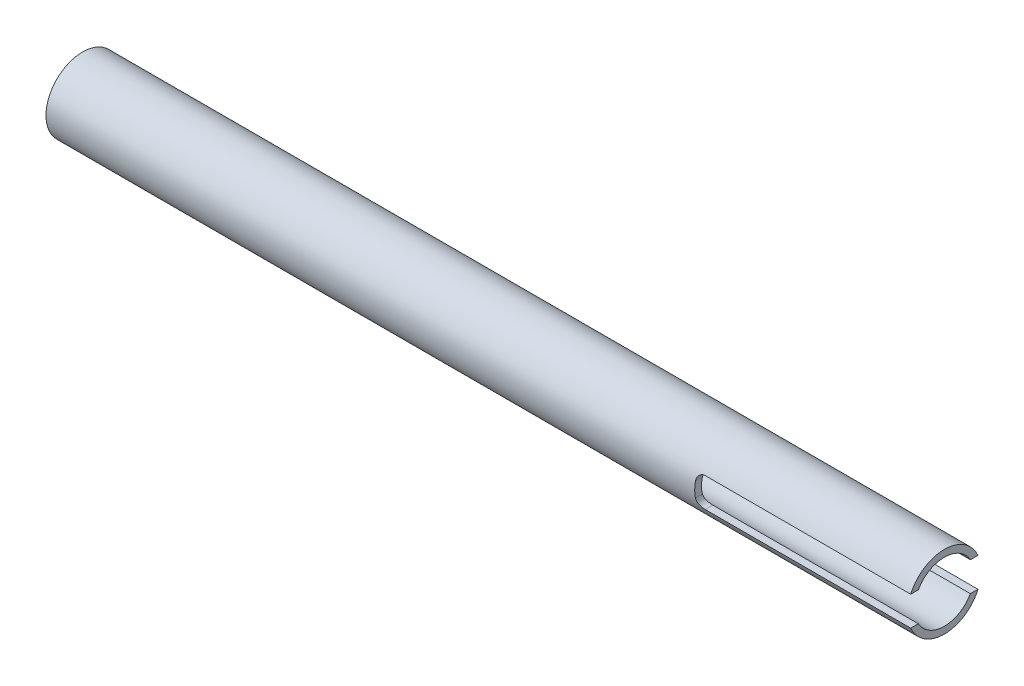
ISO-10303-21;
HEADER;
FILE_DESCRIPTION(('STEP AP214'),'2;1');
FILE_NAME('part.step','',(''),(''),'','','');
FILE_SCHEMA(('AUTOMOTIVE_DESIGN { 1 0 10303 214 1 1 1 1 }'));
ENDSEC;
DATA;
#1=APPLICATION_CONTEXT('core data for automotive mechanical design processes');
#2=APPLICATION_PROTOCOL_DEFINITION('international standard','automotive_design',2000,#1);
#3=PRODUCT_CONTEXT('',#1,'mechanical');
#4=PRODUCT('Part','Part','',(#3));
#5=PRODUCT_RELATED_PRODUCT_CATEGORY('part','',(#4));
#6=PRODUCT_DEFINITION_FORMATION('','',#4);
#7=PRODUCT_DEFINITION_CONTEXT('part definition',#1,'design');
#8=PRODUCT_DEFINITION('design','',#6,#7);
#9=PRODUCT_DEFINITION_SHAPE('','',#8);
#10=(LENGTH_UNIT() NAMED_UNIT(*) SI_UNIT(.MILLI.,.METRE.));
#11=(NAMED_UNIT(*) PLANE_ANGLE_UNIT() SI_UNIT($,.RADIAN.));
#12=(NAMED_UNIT(*) SI_UNIT($,.STERADIAN.) SOLID_ANGLE_UNIT());
#13=UNCERTAINTY_MEASURE_WITH_UNIT(LENGTH_MEASURE(1.E-05),#10,'distance_accuracy_value','');
#14=(GEOMETRIC_REPRESENTATION_CONTEXT(3) GLOBAL_UNCERTAINTY_ASSIGNED_CONTEXT((#13)) GLOBAL_UNIT_ASSIGNED_CONTEXT((#10,
#11,#12)) REPRESENTATION_CONTEXT('',''));
#15=CARTESIAN_POINT('',(0.,0.,0.));
#16=DIRECTION('',(0.,0.,1.));
#17=DIRECTION('',(1.,0.,0.));
#18=AXIS2_PLACEMENT_3D('',#15,#16,#17);
#19=CARTESIAN_POINT('',(98.6103231601427,-4.7625,2.1524775964989E-13));
#20=DIRECTION('',(-1.,0.,0.));
#21=DIRECTION('',(0.,0.,1.));
#22=AXIS2_PLACEMENT_3D('',#19,#20,#21);
#23=PLANE('',#22);
#24=CARTESIAN_POINT('',(98.6103231601427,0.,0.));
#25=DIRECTION('',(-1.,0.,0.));
#26=DIRECTION('',(0.,0.,1.));
#27=AXIS2_PLACEMENT_3D('',#24,#25,#26);
#28=CIRCLE('',#27,7.9375);
#29=CARTESIAN_POINT('',(98.6103231601427,3.175,7.27483891574239));
#30=VERTEX_POINT('',#29);
#31=CARTESIAN_POINT('',(98.6103231601427,3.175,-7.27483891574239));
#32=VERTEX_POINT('',#31);
#33=EDGE_CURVE('E154',#30,#32,#28,.T.);
#34=ORIENTED_EDGE('',*,*,#33,.F.);
#35=DIRECTION('',(0.,0.,-1.));
#36=VECTOR('',#35,1.);
#37=CARTESIAN_POINT('',(98.6103231601427,3.175,2.1524775964989E-13));
#38=LINE('',#37,#36);
#39=CARTESIAN_POINT('',(98.6103231601427,3.175,5.63085690548073));
#40=VERTEX_POINT('',#39);
#41=EDGE_CURVE('E165',#30,#40,#38,.T.);
#42=ORIENTED_EDGE('',*,*,#41,.T.);
#43=CARTESIAN_POINT('',(98.6103231601427,0.,0.));
#44=DIRECTION('',(-1.,0.,0.));
#45=DIRECTION('',(0.,0.,1.));
#46=AXIS2_PLACEMENT_3D('',#43,#44,#45);
#47=CIRCLE('',#46,6.4643);
#48=CARTESIAN_POINT('',(98.6103231601427,3.175,-5.63085690548073));
#49=VERTEX_POINT('',#48);
#50=EDGE_CURVE('E140',#40,#49,#47,.T.);
#51=ORIENTED_EDGE('',*,*,#50,.T.);
#52=EDGE_CURVE('E162',#49,#32,#38,.T.);
#53=ORIENTED_EDGE('',*,*,#52,.T.);
#54=EDGE_LOOP('',(#34,#42,#51,#53));
#55=FACE_BOUND('',#54,.T.);
#56=ADVANCED_FACE('F33',(#55),#23,.F.);
#57=CARTESIAN_POINT('',(165.510963462816,0.,0.));
#58=DIRECTION('',(-1.,0.,0.));
#59=DIRECTION('',(0.,0.,1.));
#60=AXIS2_PLACEMENT_3D('',#57,#58,#59);
#61=CYLINDRICAL_SURFACE('',#60,7.9375);
#62=DIRECTION('',(-1.,0.,0.));
#63=VECTOR('',#62,1.);
#64=CARTESIAN_POINT('',(165.510963462816,-3.17500000000006,7.27483891574237));
#65=LINE('',#64,#63);
#66=CARTESIAN_POINT('',(98.6103231601427,-3.17500000000002,7.27483891574238));
#67=VERTEX_POINT('',#66);
#68=CARTESIAN_POINT('',(54.1603231601427,-3.17500000000006,7.27483891574237));
#69=VERTEX_POINT('',#68);
#70=EDGE_CURVE('E134',#67,#69,#65,.T.);
#71=ORIENTED_EDGE('',*,*,#70,.T.);
#72=CARTESIAN_POINT('',(54.1603231601427,-3.175,7.27483891574237));
#73=CARTESIAN_POINT('',(54.1179516081605,-3.17500168113659,7.27483586366097));
#74=CARTESIAN_POINT('',(54.0756019124971,-3.17330245165568,7.27558001702575));
#75=CARTESIAN_POINT('',(53.9912360980274,-3.16653661877879,7.278528185394));
#76=CARTESIAN_POINT('',(53.9492198826457,-3.16147102917759,7.28073176088511));
#77=CARTESIAN_POINT('',(53.8244375246308,-3.14133450163409,7.28945465778901));
#78=CARTESIAN_POINT('',(53.742557205541,-3.12132308750015,7.29808678684576));
#79=CARTESIAN_POINT('',(53.5836993175407,-3.06894040253672,7.32026684625098));
#80=CARTESIAN_POINT('',(53.5067183423535,-3.03657783085928,7.3338113164125));
#81=CARTESIAN_POINT('',(53.3593257619782,-2.96061234627716,7.36480545430105));
#82=CARTESIAN_POINT('',(53.288918905137,-2.91700139314279,7.38225791423852));
#83=CARTESIAN_POINT('',(53.1532446162687,-2.81767453343915,7.42075264717216));
#84=CARTESIAN_POINT('',(53.0883436065064,-2.761507548697,7.44191980144858));
#85=CARTESIAN_POINT('',(52.9686580828009,-2.63982081610504,7.48594933347426));
#86=CARTESIAN_POINT('',(52.9138775707845,-2.57429738653621,7.50881237683834));
#87=CARTESIAN_POINT('',(52.8122001837123,-2.43069507728353,7.55656843444929));
#88=CARTESIAN_POINT('',(52.7660956547369,-2.35206470826204,7.58149355937878));
#89=CARTESIAN_POINT('',(52.6879300505377,-2.18789362747879,7.63048866953836));
#90=CARTESIAN_POINT('',(52.6558615639308,-2.10235659094262,7.65455909988382));
#91=CARTESIAN_POINT('',(52.612036569158,-1.94541809174971,7.69573507431979));
#92=CARTESIAN_POINT('',(52.5974014643123,-1.87491037842448,7.71322855066071));
#93=CARTESIAN_POINT('',(52.5777857024585,-1.73219113401289,7.74654000063456));
#94=CARTESIAN_POINT('',(52.5728038714948,-1.65997981118744,7.76235817778308));
#95=CARTESIAN_POINT('',(52.5728231601427,-1.5875,7.77712993333659));
#96=B_SPLINE_CURVE_WITH_KNOTS('',3,(#72,#73,#74,#75,#76,#77,#78,#79,#80,#81,#82,#83,#84,#85,#86,
#87,#88,#89,#90,#91,#92,#93,#94,#95),.UNSPECIFIED.,.F.,.F.,(4,2,2,2,2,2,2,2,2,2,2,4),(0.,
0.127031494291908,0.254024749792386,0.506885265042627,0.759568013575092,1.01243188015945,
1.27651034681327,1.54069301498295,1.822890957958,2.10493971303589,2.32661111398098,
2.54825555529032),.UNSPECIFIED.);
#97=CARTESIAN_POINT('',(52.5728231601427,-1.5875,7.77712993333659));
#98=VERTEX_POINT('',#97);
#99=EDGE_CURVE('E246',#69,#98,#96,.T.);
#100=ORIENTED_EDGE('',*,*,#99,.T.);
#101=CARTESIAN_POINT('',(52.5728231601427,0.,0.));
#102=DIRECTION('',(-1.,0.,0.));
#103=DIRECTION('',(0.,0.,1.));
#104=AXIS2_PLACEMENT_3D('',#101,#102,#103);
#105=CIRCLE('',#104,7.9375);
#106=CARTESIAN_POINT('',(52.5728231601427,1.5875,7.77712993333659));
#107=VERTEX_POINT('',#106);
#108=EDGE_CURVE('E260',#98,#107,#105,.T.);
#109=ORIENTED_EDGE('',*,*,#108,.T.);
#110=CARTESIAN_POINT('',(52.5728231601427,1.5875,7.77712993333659));
#111=CARTESIAN_POINT('',(52.572823403733,1.63350676862773,7.76774126330065));
#112=CARTESIAN_POINT('',(52.57482406485,1.67940359564177,7.75794444810861));
#113=CARTESIAN_POINT('',(52.5827614281683,1.77068039580911,7.73762089991974));
#114=CARTESIAN_POINT('',(52.5886970969167,1.81606050148705,7.72709435922087));
#115=CARTESIAN_POINT('',(52.6122700461677,1.95078228156833,7.6945984520111));
#116=CARTESIAN_POINT('',(52.63567399309,2.03894812030823,7.67166299368629));
#117=CARTESIAN_POINT('',(52.6969541902617,2.20953807004376,7.62428385726793));
#118=CARTESIAN_POINT('',(52.7348228805214,2.29196515383515,7.59984097261638));
#119=CARTESIAN_POINT('',(52.8239701505632,2.44917385980105,7.55064502184106));
#120=CARTESIAN_POINT('',(52.875254318008,2.52395227814499,7.52589183057164));
#121=CARTESIAN_POINT('',(52.9912413659634,2.66543932718694,7.47696931777062));
#122=CARTESIAN_POINT('',(53.0562100910787,2.73193883493113,7.45282414598359));
#123=CARTESIAN_POINT('',(53.1973483049117,2.85299322074861,7.40732925012121));
#124=CARTESIAN_POINT('',(53.2735181882435,2.90754767783193,7.38597962458242));
#125=CARTESIAN_POINT('',(53.4330918887273,3.00159155783955,7.34825600672414));
#126=CARTESIAN_POINT('',(53.5162663439875,3.04142452291152,7.33177064627855));
#127=CARTESIAN_POINT('',(53.6890369760882,3.10622330269326,7.30455577634143));
#128=CARTESIAN_POINT('',(53.7786218532568,3.13121458917045,7.29381640854949));
#129=CARTESIAN_POINT('',(53.9176696730244,3.157101940763,7.28263004031741));
#130=CARTESIAN_POINT('',(53.9659248998652,3.16380495831029,7.27971714426164));
#131=CARTESIAN_POINT('',(54.0628843182944,3.17275416759985,7.2758193784974));
#132=CARTESIAN_POINT('',(54.1115881192123,3.17500392571316,7.27483296598247));
#133=CARTESIAN_POINT('',(54.1603231601427,3.175,7.27483891574239));
#134=B_SPLINE_CURVE_WITH_KNOTS('',3,(#110,#111,#112,#113,#114,#115,#116,#117,#118,#119,#120,
#121,#122,#123,#124,#125,#126,#127,#128,#129,#130,#131,#132,#133),.UNSPECIFIED.,.F.,.F.,(4,2,2,
2,2,2,2,2,2,2,2,4),(0.,0.140770845296605,0.281504734514007,0.562238948643031,0.842826637517772,
1.12353138019525,1.41029752992662,1.69707378478449,1.97665708187304,2.255759151943,
2.40195937855942,2.54804247399296),.UNSPECIFIED.);
#135=CARTESIAN_POINT('',(54.1603231601427,3.175,7.27483891574239));
#136=VERTEX_POINT('',#135);
#137=EDGE_CURVE('E196',#107,#136,#134,.T.);
#138=ORIENTED_EDGE('',*,*,#137,.T.);
#139=DIRECTION('',(-1.,0.,0.));
#140=VECTOR('',#139,1.);
#141=CARTESIAN_POINT('',(165.510963462816,3.175,7.27483891574239));
#142=LINE('',#141,#140);
#143=EDGE_CURVE('E258',#136,#30,#142,.F.);
#144=ORIENTED_EDGE('',*,*,#143,.T.);
#145=ORIENTED_EDGE('',*,*,#33,.T.);
#146=DIRECTION('',(-1.,0.,0.));
#147=VECTOR('',#146,1.);
#148=CARTESIAN_POINT('',(165.510963462816,3.175,-7.27483891574239));
#149=LINE('',#148,#147);
#150=CARTESIAN_POINT('',(54.1603231601427,3.175,-7.27483891574239));
#151=VERTEX_POINT('',#150);
#152=EDGE_CURVE('E283',#32,#151,#149,.T.);
#153=ORIENTED_EDGE('',*,*,#152,.T.);
#154=CARTESIAN_POINT('',(54.1603231601427,3.175,-7.27483891574239));
#155=CARTESIAN_POINT('',(54.1179516081605,3.17500168113659,-7.27483586366097));
#156=CARTESIAN_POINT('',(54.0756019124971,3.17330245165569,-7.27558001702575));
#157=CARTESIAN_POINT('',(53.9912360980274,3.16653661877879,-7.27852818539399));
#158=CARTESIAN_POINT('',(53.9492198826457,3.16147102917759,-7.28073176088511));
#159=CARTESIAN_POINT('',(53.8244375246308,3.1413345016341,-7.28945465778901));
#160=CARTESIAN_POINT('',(53.742557205541,3.12132308750015,-7.29808678684576));
#161=CARTESIAN_POINT('',(53.5836993175407,3.06894040253673,-7.32026684625098));
#162=CARTESIAN_POINT('',(53.5067183423535,3.03657783085928,-7.3338113164125));
#163=CARTESIAN_POINT('',(53.3593257619782,2.96061234627716,-7.36480545430105));
#164=CARTESIAN_POINT('',(53.288918905137,2.9170013931428,-7.38225791423852));
#165=CARTESIAN_POINT('',(53.1532446162687,2.81767453343915,-7.42075264717216));
#166=CARTESIAN_POINT('',(53.0883436065064,2.76150754869701,-7.44191980144858));
#167=CARTESIAN_POINT('',(52.9686580828009,2.63982081610504,-7.48594933347426));
#168=CARTESIAN_POINT('',(52.9138775707845,2.57429738653622,-7.50881237683833));
#169=CARTESIAN_POINT('',(52.8122001837123,2.43069507728354,-7.55656843444929));
#170=CARTESIAN_POINT('',(52.7660956547369,2.35206470826205,-7.58149355937878));
#171=CARTESIAN_POINT('',(52.6879300505377,2.1878936274788,-7.63048866953836));
#172=CARTESIAN_POINT('',(52.6558615639308,2.10235659094262,-7.65455909988382));
#173=CARTESIAN_POINT('',(52.612036569158,1.94541809174971,-7.69573507431979));
#174=CARTESIAN_POINT('',(52.5974014643123,1.87491037842449,-7.71322855066071));
#175=CARTESIAN_POINT('',(52.5777857024585,1.73219113401289,-7.74654000063456));
#176=CARTESIAN_POINT('',(52.5728038714948,1.65997981118744,-7.76235817778308));
#177=CARTESIAN_POINT('',(52.5728231601427,1.5875,-7.77712993333659));
#178=B_SPLINE_CURVE_WITH_KNOTS('',3,(#154,#155,#156,#157,#158,#159,#160,#161,#162,#163,#164,
#165,#166,#167,#168,#169,#170,#171,#172,#173,#174,#175,#176,#177),.UNSPECIFIED.,.F.,.F.,(4,2,2,
2,2,2,2,2,2,2,2,4),(0.,0.127031494291908,0.254024749792379,0.506885265042626,0.759568013575091,
1.01243188015945,1.27651034681327,1.54069301498295,1.822890957958,2.10493971303589,
2.32661111398098,2.54825555529032),.UNSPECIFIED.);
#179=CARTESIAN_POINT('',(52.5728231601427,1.5875,-7.77712993333659));
#180=VERTEX_POINT('',#179);
#181=EDGE_CURVE('E47',#151,#180,#178,.T.);
#182=ORIENTED_EDGE('',*,*,#181,.T.);
#183=CARTESIAN_POINT('',(52.5728231601427,-1.5875,-7.77712993333659));
#184=VERTEX_POINT('',#183);
#185=EDGE_CURVE('E287',#180,#184,#105,.T.);
#186=ORIENTED_EDGE('',*,*,#185,.T.);
#187=CARTESIAN_POINT('',(52.5728231601427,-1.5875,-7.77712993333659));
#188=CARTESIAN_POINT('',(52.572823403733,-1.63350676862772,-7.76774126330065));
#189=CARTESIAN_POINT('',(52.57482406485,-1.67940359564176,-7.75794444810861));
#190=CARTESIAN_POINT('',(52.5827614281683,-1.77068039580911,-7.73762089991974));
#191=CARTESIAN_POINT('',(52.5886970969167,-1.81606050148704,-7.72709435922087));
#192=CARTESIAN_POINT('',(52.6122700461677,-1.95078228156833,-7.6945984520111));
#193=CARTESIAN_POINT('',(52.63567399309,-2.03894812030822,-7.67166299368629));
#194=CARTESIAN_POINT('',(52.6969541902617,-2.20953807004376,-7.62428385726794));
#195=CARTESIAN_POINT('',(52.7348228805214,-2.29196515383515,-7.59984097261638));
#196=CARTESIAN_POINT('',(52.8239701505632,-2.44917385980105,-7.55064502184107));
#197=CARTESIAN_POINT('',(52.875254318008,-2.52395227814499,-7.52589183057165));
#198=CARTESIAN_POINT('',(52.9912413659634,-2.66543932718693,-7.47696931777062));
#199=CARTESIAN_POINT('',(53.0562100910787,-2.73193883493113,-7.4528241459836));
#200=CARTESIAN_POINT('',(53.1973483049117,-2.85299322074861,-7.40732925012122));
#201=CARTESIAN_POINT('',(53.2735181882435,-2.90754767783193,-7.38597962458242));
#202=CARTESIAN_POINT('',(53.4330918887273,-3.00159155783955,-7.34825600672415));
#203=CARTESIAN_POINT('',(53.5162663439875,-3.04142452291151,-7.33177064627855));
#204=CARTESIAN_POINT('',(53.6890369760882,-3.10622330269326,-7.30455577634143));
#205=CARTESIAN_POINT('',(53.7786218532568,-3.13121458917044,-7.2938164085495));
#206=CARTESIAN_POINT('',(53.9176696730244,-3.157101940763,-7.28263004031741));
#207=CARTESIAN_POINT('',(53.9659248998652,-3.16380495831028,-7.27971714426164));
#208=CARTESIAN_POINT('',(54.0628843182944,-3.17275416759984,-7.2758193784974));
#209=CARTESIAN_POINT('',(54.1115881192123,-3.17500392571316,-7.27483296598247));
#210=CARTESIAN_POINT('',(54.1603231601427,-3.175,-7.2748389157424));
#211=B_SPLINE_CURVE_WITH_KNOTS('',3,(#187,#188,#189,#190,#191,#192,#193,#194,#195,#196,#197,
#198,#199,#200,#201,#202,#203,#204,#205,#206,#207,#208,#209,#210),.UNSPECIFIED.,.F.,.F.,(4,2,2,
2,2,2,2,2,2,2,2,4),(0.,0.140770845296605,0.281504734514007,0.562238948643031,0.842826637517772,
1.12353138019525,1.41029752992662,1.69707378478449,1.97665708187304,2.255759151943,
2.40195937855943,2.54804247399297),.UNSPECIFIED.);
#212=CARTESIAN_POINT('',(54.1603231601427,-3.17500000000006,-7.27483891574237));
#213=VERTEX_POINT('',#212);
#214=EDGE_CURVE('E227',#184,#213,#211,.T.);
#215=ORIENTED_EDGE('',*,*,#214,.T.);
#216=DIRECTION('',(-1.,0.,0.));
#217=VECTOR('',#216,1.);
#218=CARTESIAN_POINT('',(165.510963462816,-3.17500000000006,-7.27483891574237));
#219=LINE('',#218,#217);
#220=CARTESIAN_POINT('',(98.6103231601427,-3.17500000000002,-7.27483891574238));
#221=VERTEX_POINT('',#220);
#222=EDGE_CURVE('E277',#213,#221,#219,.F.);
#223=ORIENTED_EDGE('',*,*,#222,.T.);
#224=EDGE_CURVE('E158',#221,#67,#28,.T.);
#225=ORIENTED_EDGE('',*,*,#224,.T.);
#226=EDGE_LOOP('',(#71,#100,#109,#138,#144,#145,#153,#182,#186,#215,#223,#225));
#227=FACE_BOUND('',#226,.T.);
#228=CARTESIAN_POINT('',(-87.67464295407,-1.66136895907165E-13,2.27596413937547E-13));
#229=DIRECTION('',(1.,0.,0.));
#230=DIRECTION('',(0.,0.,-1.));
#231=AXIS2_PLACEMENT_3D('',#228,#229,#230);
#232=CIRCLE('',#231,7.9375);
#233=CARTESIAN_POINT('',(-87.67464295407,-1.66412283258976E-13,-7.93749999999977));
#234=VERTEX_POINT('',#233);
#235=EDGE_CURVE('E292',#234,#234,#232,.T.);
#236=ORIENTED_EDGE('',*,*,#235,.T.);
#237=EDGE_LOOP('',(#236));
#238=FACE_BOUND('',#237,.T.);
#239=ADVANCED_FACE('F209',(#227,#238),#61,.T.);
#240=CARTESIAN_POINT('',(165.510963462816,0.,0.));
#241=DIRECTION('',(-1.,0.,0.));
#242=DIRECTION('',(0.,0.,1.));
#243=AXIS2_PLACEMENT_3D('',#240,#241,#242);
#244=CYLINDRICAL_SURFACE('',#243,6.4643);
#245=DIRECTION('',(-1.,0.,0.));
#246=VECTOR('',#245,1.);
#247=CARTESIAN_POINT('',(165.510963462816,3.175,5.63085690548073));
#248=LINE('',#247,#246);
#249=CARTESIAN_POINT('',(54.1603231601427,3.175,5.63085690548073));
#250=VERTEX_POINT('',#249);
#251=EDGE_CURVE('E268',#250,#40,#248,.F.);
#252=ORIENTED_EDGE('',*,*,#251,.F.);
#253=CARTESIAN_POINT('',(54.1603231601427,3.175,5.63085690548073));
#254=CARTESIAN_POINT('',(54.1191663294675,3.17500265942431,5.63085243150939));
#255=CARTESIAN_POINT('',(54.0780318072932,3.17339835018606,5.63176028239596));
#256=CARTESIAN_POINT('',(53.9961059919526,3.16701766507687,5.6353521570195));
#257=CARTESIAN_POINT('',(53.9553145511114,3.16224273305131,5.63803537228504));
#258=CARTESIAN_POINT('',(53.8343193243378,3.14329664507894,5.64863522411123));
#259=CARTESIAN_POINT('',(53.755007271897,3.12450305374455,5.65910325483872));
#260=CARTESIAN_POINT('',(53.6012573773987,3.0754916504055,5.68588522764517));
#261=CARTESIAN_POINT('',(53.5268129170788,3.0452897453746,5.7021910282914));
#262=CARTESIAN_POINT('',(53.3841452960827,2.97460119282056,5.73938277272117));
#263=CARTESIAN_POINT('',(53.3159294121919,2.93410271969421,5.76027397904373));
#264=CARTESIAN_POINT('',(53.1826514439318,2.84103773378421,5.80676804025646));
#265=CARTESIAN_POINT('',(53.1181052818695,2.78784532739572,5.83259254506422));
#266=CARTESIAN_POINT('',(52.9985385718316,2.67254263369961,5.88631786935968));
#267=CARTESIAN_POINT('',(52.9435224909978,2.61042818908352,5.91421965383983));
#268=CARTESIAN_POINT('',(52.8385056426909,2.47143371409535,5.97373371686979));
#269=CARTESIAN_POINT('',(52.7896952231351,2.39368295701582,6.00542032126396));
#270=CARTESIAN_POINT('',(52.7060678250846,2.2306822521568,6.0678536497522));
#271=CARTESIAN_POINT('',(52.6712438221118,2.14543609512391,6.09860083846706));
#272=CARTESIAN_POINT('',(52.6206465484794,1.98216120584023,6.15341243852268));
#273=CARTESIAN_POINT('',(52.6028496375441,1.90486553835026,6.17780100436403));
#274=CARTESIAN_POINT('',(52.5789204697349,1.74771289593288,6.22410888754503));
#275=CARTESIAN_POINT('',(52.5727973466511,1.66785396509172,6.24602625877211));
#276=CARTESIAN_POINT('',(52.5728231601427,1.5875,6.26634009929241));
#277=B_SPLINE_CURVE_WITH_KNOTS('',3,(#253,#254,#255,#256,#257,#258,#259,#260,#261,#262,#263,
#264,#265,#266,#267,#268,#269,#270,#271,#272,#273,#274,#275,#276),.UNSPECIFIED.,.F.,.F.,(4,2,2,
2,2,2,2,2,2,2,2,4),(0.,0.123386261727172,0.246716374037826,0.491934980105696,0.736812924701847,
0.981973392060158,1.24352761602777,1.50520411142378,1.7952497086635,2.08514945193374,
2.33322496948238,2.58149450643057),.UNSPECIFIED.);
#278=CARTESIAN_POINT('',(52.5728231601427,1.5875,6.26634009929241));
#279=VERTEX_POINT('',#278);
#280=EDGE_CURVE('E189',#250,#279,#277,.T.);
#281=ORIENTED_EDGE('',*,*,#280,.T.);
#282=CARTESIAN_POINT('',(52.5728231601427,0.,0.));
#283=DIRECTION('',(-1.,0.,0.));
#284=DIRECTION('',(0.,0.,1.));
#285=AXIS2_PLACEMENT_3D('',#282,#283,#284);
#286=CIRCLE('',#285,6.4643);
#287=CARTESIAN_POINT('',(52.5728231601427,-1.5875,6.26634009929241));
#288=VERTEX_POINT('',#287);
#289=EDGE_CURVE('E169',#288,#279,#286,.T.);
#290=ORIENTED_EDGE('',*,*,#289,.F.);
#291=CARTESIAN_POINT('',(52.5728231601427,-1.5875,6.26634009929241));
#292=CARTESIAN_POINT('',(52.572823381558,-1.63418900680278,6.25451519937794));
#293=CARTESIAN_POINT('',(52.5748836740983,-1.68071621150091,6.2421690242475));
#294=CARTESIAN_POINT('',(52.5830320857824,-1.77313930969813,6.21654599792507));
#295=CARTESIAN_POINT('',(52.589118660749,-1.81903543834437,6.20326950527711));
#296=CARTESIAN_POINT('',(52.6132295844974,-1.95507469082072,6.16228683989147));
#297=CARTESIAN_POINT('',(52.6371064034357,-2.04387534201677,6.13334935224698));
#298=CARTESIAN_POINT('',(52.6993911097832,-2.21532061503981,6.07353181019978));
#299=CARTESIAN_POINT('',(52.7377833915644,-2.29797173444354,6.04265387160463));
#300=CARTESIAN_POINT('',(52.8280183454589,-2.45546303738963,5.98038883139863));
#301=CARTESIAN_POINT('',(52.8798715772794,-2.53029702370295,5.94900134826912));
#302=CARTESIAN_POINT('',(52.9979952941519,-2.67287075398233,5.88635884745835));
#303=CARTESIAN_POINT('',(53.0647191797911,-2.74025626996522,5.85514963173659));
#304=CARTESIAN_POINT('',(53.2100564411628,-2.86271368076049,5.79626340236598));
#305=CARTESIAN_POINT('',(53.2886698104279,-2.91778558227084,5.76858638679577));
#306=CARTESIAN_POINT('',(53.4528917446734,-3.01168872656629,5.72010524984432));
#307=CARTESIAN_POINT('',(53.5381343480135,-3.05104502216775,5.6990849029132));
#308=CARTESIAN_POINT('',(53.7155351424931,-3.11430373465245,5.66476886814871));
#309=CARTESIAN_POINT('',(53.8076749418361,-3.13824572360375,5.6514534090763));
#310=CARTESIAN_POINT('',(53.9441679497105,-3.16081362599346,5.63883740321027));
#311=CARTESIAN_POINT('',(53.9871766967769,-3.16612512648615,5.63585394797714));
#312=CARTESIAN_POINT('',(54.0735547373811,-3.1732182894863,5.63186201493138));
#313=CARTESIAN_POINT('',(54.1169238561998,-3.17500157254309,5.63085263040865));
#314=CARTESIAN_POINT('',(54.1603231601427,-3.175,5.63085690548073));
#315=B_SPLINE_CURVE_WITH_KNOTS('',3,(#291,#292,#293,#294,#295,#296,#297,#298,#299,#300,#301,
#302,#303,#304,#305,#306,#307,#308,#309,#310,#311,#312,#313,#314),.UNSPECIFIED.,.F.,.F.,(4,2,2,
2,2,2,2,2,2,2,2,4),(0.,0.144388740940301,0.288722137366155,0.576452128922376,0.863873656489901,
1.15152134248761,1.44956694911564,1.74761239362143,2.03464137858756,2.32093052452345,
2.45108160789036,2.58117289753275),.UNSPECIFIED.);
#316=CARTESIAN_POINT('',(54.1603231601427,-3.17500000000006,5.63085690548069));
#317=VERTEX_POINT('',#316);
#318=EDGE_CURVE('E149',#288,#317,#315,.T.);
#319=ORIENTED_EDGE('',*,*,#318,.T.);
#320=DIRECTION('',(-1.,0.,0.));
#321=VECTOR('',#320,1.);
#322=CARTESIAN_POINT('',(165.510963462816,-3.17500000000006,5.63085690548069));
#323=LINE('',#322,#321);
#324=CARTESIAN_POINT('',(98.6103231601427,-3.17500000000002,5.63085690548072));
#325=VERTEX_POINT('',#324);
#326=EDGE_CURVE('E131',#325,#317,#323,.T.);
#327=ORIENTED_EDGE('',*,*,#326,.F.);
#328=CARTESIAN_POINT('',(98.6103231601427,-3.17500000000002,-5.63085690548072));
#329=VERTEX_POINT('',#328);
#330=EDGE_CURVE('E147',#329,#325,#47,.T.);
#331=ORIENTED_EDGE('',*,*,#330,.F.);
#332=DIRECTION('',(-1.,0.,0.));
#333=VECTOR('',#332,1.);
#334=CARTESIAN_POINT('',(165.510963462816,-3.17500000000006,-5.63085690548069));
#335=LINE('',#334,#333);
#336=CARTESIAN_POINT('',(54.1603231601427,-3.17500000000006,-5.63085690548069));
#337=VERTEX_POINT('',#336);
#338=EDGE_CURVE('E275',#337,#329,#335,.F.);
#339=ORIENTED_EDGE('',*,*,#338,.F.);
#340=CARTESIAN_POINT('',(54.1603231601427,-3.175,-5.63085690548069));
#341=CARTESIAN_POINT('',(54.1191663294675,-3.17500265942431,-5.63085243150938));
#342=CARTESIAN_POINT('',(54.0780318072932,-3.17339835018606,-5.63176028239596));
#343=CARTESIAN_POINT('',(53.9961059919526,-3.16701766507687,-5.63535215701951));
#344=CARTESIAN_POINT('',(53.9553145511114,-3.1622427330513,-5.63803537228504));
#345=CARTESIAN_POINT('',(53.8343193243378,-3.14329664507894,-5.64863522411123));
#346=CARTESIAN_POINT('',(53.755007271897,-3.12450305374455,-5.65910325483872));
#347=CARTESIAN_POINT('',(53.6012573773987,-3.0754916504055,-5.68588522764517));
#348=CARTESIAN_POINT('',(53.5268129170788,-3.0452897453746,-5.7021910282914));
#349=CARTESIAN_POINT('',(53.3841452960827,-2.97460119282056,-5.73938277272117));
#350=CARTESIAN_POINT('',(53.3159294121919,-2.93410271969421,-5.76027397904373));
#351=CARTESIAN_POINT('',(53.1826514439318,-2.84103773378421,-5.80676804025646));
#352=CARTESIAN_POINT('',(53.1181052818695,-2.78784532739572,-5.83259254506421));
#353=CARTESIAN_POINT('',(52.9985385718316,-2.67254263369961,-5.88631786935968));
#354=CARTESIAN_POINT('',(52.9435224909978,-2.61042818908352,-5.91421965383983));
#355=CARTESIAN_POINT('',(52.8385056426909,-2.47143371409535,-5.97373371686978));
#356=CARTESIAN_POINT('',(52.7896952231351,-2.39368295701582,-6.00542032126396));
#357=CARTESIAN_POINT('',(52.7060678250846,-2.23068225215681,-6.06785364975219));
#358=CARTESIAN_POINT('',(52.6712438221118,-2.14543609512391,-6.09860083846706));
#359=CARTESIAN_POINT('',(52.6206465484794,-1.98216120584023,-6.15341243852268));
#360=CARTESIAN_POINT('',(52.6028496375441,-1.90486553835026,-6.17780100436402));
#361=CARTESIAN_POINT('',(52.5789204697349,-1.74771289593288,-6.22410888754503));
#362=CARTESIAN_POINT('',(52.5727973466511,-1.66785396509172,-6.24602625877211));
#363=CARTESIAN_POINT('',(52.5728231601427,-1.5875,-6.26634009929241));
#364=B_SPLINE_CURVE_WITH_KNOTS('',3,(#340,#341,#342,#343,#344,#345,#346,#347,#348,#349,#350,
#351,#352,#353,#354,#355,#356,#357,#358,#359,#360,#361,#362,#363),.UNSPECIFIED.,.F.,.F.,(4,2,2,
2,2,2,2,2,2,2,2,4),(0.,0.123386261727166,0.246716374037827,0.49193498010569,0.73681292470184,
0.98197339206015,1.24352761602776,1.50520411142376,1.79524970866349,2.08514945193373,
2.33322496948237,2.58149450643057),.UNSPECIFIED.);
#365=CARTESIAN_POINT('',(52.5728231601427,-1.5875,-6.26634009929241));
#366=VERTEX_POINT('',#365);
#367=EDGE_CURVE('E221',#337,#366,#364,.T.);
#368=ORIENTED_EDGE('',*,*,#367,.T.);
#369=CARTESIAN_POINT('',(52.5728231601427,1.5875,-6.26634009929241));
#370=VERTEX_POINT('',#369);
#371=EDGE_CURVE('E166',#370,#366,#286,.T.);
#372=ORIENTED_EDGE('',*,*,#371,.F.);
#373=CARTESIAN_POINT('',(52.5728231601427,1.5875,-6.26634009929241));
#374=CARTESIAN_POINT('',(52.572823381558,1.63418900680279,-6.25451519937794));
#375=CARTESIAN_POINT('',(52.5748836740983,1.68071621150091,-6.2421690242475));
#376=CARTESIAN_POINT('',(52.5830320857824,1.77313930969814,-6.21654599792506));
#377=CARTESIAN_POINT('',(52.589118660749,1.81903543834437,-6.20326950527711));
#378=CARTESIAN_POINT('',(52.6132295844974,1.95507469082073,-6.16228683989147));
#379=CARTESIAN_POINT('',(52.6371064034357,2.04387534201678,-6.13334935224697));
#380=CARTESIAN_POINT('',(52.6993911097832,2.21532061503982,-6.07353181019978));
#381=CARTESIAN_POINT('',(52.7377833915644,2.29797173444355,-6.04265387160463));
#382=CARTESIAN_POINT('',(52.8280183454589,2.45546303738964,-5.98038883139863));
#383=CARTESIAN_POINT('',(52.8798715772794,2.53029702370295,-5.94900134826912));
#384=CARTESIAN_POINT('',(52.9979952941519,2.67287075398233,-5.88635884745834));
#385=CARTESIAN_POINT('',(53.0647191797911,2.74025626996522,-5.85514963173659));
#386=CARTESIAN_POINT('',(53.2100564411628,2.86271368076049,-5.79626340236598));
#387=CARTESIAN_POINT('',(53.2886698104279,2.91778558227084,-5.76858638679577));
#388=CARTESIAN_POINT('',(53.4528917446734,3.01168872656629,-5.72010524984432));
#389=CARTESIAN_POINT('',(53.5381343480135,3.05104502216775,-5.6990849029132));
#390=CARTESIAN_POINT('',(53.7155351424931,3.11430373465245,-5.66476886814871));
#391=CARTESIAN_POINT('',(53.8076749418361,3.13824572360376,-5.6514534090763));
#392=CARTESIAN_POINT('',(53.9441679497105,3.16081362599346,-5.63883740321027));
#393=CARTESIAN_POINT('',(53.9871766967769,3.16612512648616,-5.63585394797714));
#394=CARTESIAN_POINT('',(54.0735547373811,3.1732182894863,-5.63186201493137));
#395=CARTESIAN_POINT('',(54.1169238561998,3.1750015725431,-5.63085263040865));
#396=CARTESIAN_POINT('',(54.1603231601427,3.175,-5.63085690548073));
#397=B_SPLINE_CURVE_WITH_KNOTS('',3,(#373,#374,#375,#376,#377,#378,#379,#380,#381,#382,#383,
#384,#385,#386,#387,#388,#389,#390,#391,#392,#393,#394,#395,#396),.UNSPECIFIED.,.F.,.F.,(4,2,2,
2,2,2,2,2,2,2,2,4),(0.,0.144388740940301,0.288722137366154,0.576452128922375,0.8638736564899,
1.15152134248761,1.44956694911564,1.74761239362142,2.03464137858756,2.32093052452344,
2.45108160789036,2.58117289753275),.UNSPECIFIED.);
#398=CARTESIAN_POINT('',(54.1603231601427,3.175,-5.63085690548073));
#399=VERTEX_POINT('',#398);
#400=EDGE_CURVE('E12',#370,#399,#397,.T.);
#401=ORIENTED_EDGE('',*,*,#400,.T.);
#402=DIRECTION('',(-1.,0.,0.));
#403=VECTOR('',#402,1.);
#404=CARTESIAN_POINT('',(165.510963462816,3.175,-5.63085690548073));
#405=LINE('',#404,#403);
#406=EDGE_CURVE('E281',#49,#399,#405,.T.);
#407=ORIENTED_EDGE('',*,*,#406,.F.);
#408=ORIENTED_EDGE('',*,*,#50,.F.);
#409=EDGE_LOOP('',(#252,#281,#290,#319,#327,#331,#339,#368,#372,#401,#407,#408));
#410=FACE_BOUND('',#409,.T.);
#411=CARTESIAN_POINT('',(-87.67464295407,-1.66136895907165E-13,2.27596413937547E-13));
#412=DIRECTION('',(1.,0.,0.));
#413=DIRECTION('',(0.,0.,-1.));
#414=AXIS2_PLACEMENT_3D('',#411,#412,#413);
#415=CIRCLE('',#414,6.4643);
#416=CARTESIAN_POINT('',(-87.67464295407,-1.6636117136648E-13,-6.46429999999977));
#417=VERTEX_POINT('',#416);
#418=EDGE_CURVE('E290',#417,#417,#415,.T.);
#419=ORIENTED_EDGE('',*,*,#418,.F.);
#420=EDGE_LOOP('',(#419));
#421=FACE_BOUND('',#420,.T.);
#422=ADVANCED_FACE('F144',(#410,#421),#244,.F.);
#423=ORIENTED_EDGE('',*,*,#224,.F.);
#424=DIRECTION('',(0.,0.,1.));
#425=VECTOR('',#424,1.);
#426=CARTESIAN_POINT('',(98.6103231601427,-3.17500000000002,2.1524775964989E-13));
#427=LINE('',#426,#425);
#428=EDGE_CURVE('E139',#221,#329,#427,.T.);
#429=ORIENTED_EDGE('',*,*,#428,.T.);
#430=ORIENTED_EDGE('',*,*,#330,.T.);
#431=EDGE_CURVE('E128',#325,#67,#427,.T.);
#432=ORIENTED_EDGE('',*,*,#431,.T.);
#433=EDGE_LOOP('',(#423,#429,#430,#432));
#434=FACE_BOUND('',#433,.T.);
#435=ADVANCED_FACE('F152',(#434),#23,.F.);
#436=CARTESIAN_POINT('',(-87.67464295407,-1.66136895907165E-13,2.27596413937547E-13));
#437=DIRECTION('',(1.,0.,0.));
#438=DIRECTION('',(0.,0.,-1.));
#439=AXIS2_PLACEMENT_3D('',#436,#437,#438);
#440=PLANE('',#439);
#441=ORIENTED_EDGE('',*,*,#418,.T.);
#442=EDGE_LOOP('',(#441));
#443=FACE_BOUND('',#442,.T.);
#444=ORIENTED_EDGE('',*,*,#235,.F.);
#445=EDGE_LOOP('',(#444));
#446=FACE_BOUND('',#445,.T.);
#447=ADVANCED_FACE('F296',(#443,#446),#440,.F.);
#448=CARTESIAN_POINT('',(52.5728231601427,-3.175,7.93750000000023));
#449=DIRECTION('',(0.,-1.,0.));
#450=DIRECTION('',(1.,0.,0.));
#451=AXIS2_PLACEMENT_3D('',#448,#449,#450);
#452=PLANE('',#451);
#453=ORIENTED_EDGE('',*,*,#326,.T.);
#454=DIRECTION('',(0.,0.,-1.));
#455=VECTOR('',#454,1.);
#456=CARTESIAN_POINT('',(54.1603231601427,-3.175,7.27483891574237));
#457=LINE('',#456,#455);
#458=EDGE_CURVE('E178',#317,#69,#457,.F.);
#459=ORIENTED_EDGE('',*,*,#458,.T.);
#460=ORIENTED_EDGE('',*,*,#70,.F.);
#461=ORIENTED_EDGE('',*,*,#431,.F.);
#462=EDGE_LOOP('',(#453,#459,#460,#461));
#463=FACE_BOUND('',#462,.T.);
#464=ADVANCED_FACE('F130',(#463),#452,.F.);
#465=CARTESIAN_POINT('',(55.7478231601427,3.175,7.93750000000023));
#466=DIRECTION('',(0.,1.,0.));
#467=DIRECTION('',(-1.,0.,0.));
#468=AXIS2_PLACEMENT_3D('',#465,#466,#467);
#469=PLANE('',#468);
#470=ORIENTED_EDGE('',*,*,#143,.F.);
#471=DIRECTION('',(0.,0.,-1.));
#472=VECTOR('',#471,1.);
#473=CARTESIAN_POINT('',(54.1603231601427,3.175,5.63085690548073));
#474=LINE('',#473,#472);
#475=EDGE_CURVE('E170',#136,#250,#474,.T.);
#476=ORIENTED_EDGE('',*,*,#475,.T.);
#477=ORIENTED_EDGE('',*,*,#251,.T.);
#478=ORIENTED_EDGE('',*,*,#41,.F.);
#479=EDGE_LOOP('',(#470,#476,#477,#478));
#480=FACE_BOUND('',#479,.T.);
#481=ADVANCED_FACE('F265',(#480),#469,.F.);
#482=CARTESIAN_POINT('',(52.5728231601427,3.175,7.93750000000023));
#483=DIRECTION('',(-1.,0.,0.));
#484=DIRECTION('',(0.,0.,1.));
#485=AXIS2_PLACEMENT_3D('',#482,#483,#484);
#486=PLANE('',#485);
#487=ORIENTED_EDGE('',*,*,#289,.T.);
#488=DIRECTION('',(0.,0.,-1.));
#489=VECTOR('',#488,1.);
#490=CARTESIAN_POINT('',(52.5728231601427,1.5875,7.27483891574239));
#491=LINE('',#490,#489);
#492=EDGE_CURVE('E176',#279,#107,#491,.F.);
#493=ORIENTED_EDGE('',*,*,#492,.T.);
#494=ORIENTED_EDGE('',*,*,#108,.F.);
#495=DIRECTION('',(0.,0.,-1.));
#496=VECTOR('',#495,1.);
#497=CARTESIAN_POINT('',(52.5728231601427,-1.5875,5.63085690548069));
#498=LINE('',#497,#496);
#499=EDGE_CURVE('E173',#98,#288,#498,.T.);
#500=ORIENTED_EDGE('',*,*,#499,.T.);
#501=EDGE_LOOP('',(#487,#493,#494,#500));
#502=FACE_BOUND('',#501,.T.);
#503=ADVANCED_FACE('F273',(#502),#486,.F.);
#504=ORIENTED_EDGE('',*,*,#371,.T.);
#505=DIRECTION('',(0.,0.,-1.));
#506=VECTOR('',#505,1.);
#507=CARTESIAN_POINT('',(52.5728231601427,-1.5875,-7.27483891574237));
#508=LINE('',#507,#506);
#509=EDGE_CURVE('E182',#366,#184,#508,.T.);
#510=ORIENTED_EDGE('',*,*,#509,.T.);
#511=ORIENTED_EDGE('',*,*,#185,.F.);
#512=DIRECTION('',(0.,0.,-1.));
#513=VECTOR('',#512,1.);
#514=CARTESIAN_POINT('',(52.5728231601427,1.5875,-5.63085690548073));
#515=LINE('',#514,#513);
#516=EDGE_CURVE('E180',#180,#370,#515,.F.);
#517=ORIENTED_EDGE('',*,*,#516,.T.);
#518=EDGE_LOOP('',(#504,#510,#511,#517));
#519=FACE_BOUND('',#518,.T.);
#520=ADVANCED_FACE('F314',(#519),#486,.F.);
#521=ORIENTED_EDGE('',*,*,#406,.T.);
#522=DIRECTION('',(0.,0.,-1.));
#523=VECTOR('',#522,1.);
#524=CARTESIAN_POINT('',(54.1603231601427,3.175,-7.27483891574239));
#525=LINE('',#524,#523);
#526=EDGE_CURVE('E187',#399,#151,#525,.T.);
#527=ORIENTED_EDGE('',*,*,#526,.T.);
#528=ORIENTED_EDGE('',*,*,#152,.F.);
#529=ORIENTED_EDGE('',*,*,#52,.F.);
#530=EDGE_LOOP('',(#521,#527,#528,#529));
#531=FACE_BOUND('',#530,.T.);
#532=ADVANCED_FACE('F312',(#531),#469,.F.);
#533=ORIENTED_EDGE('',*,*,#222,.F.);
#534=DIRECTION('',(0.,0.,-1.));
#535=VECTOR('',#534,1.);
#536=CARTESIAN_POINT('',(54.1603231601427,-3.175,-5.6308569054807));
#537=LINE('',#536,#535);
#538=EDGE_CURVE('E185',#213,#337,#537,.F.);
#539=ORIENTED_EDGE('',*,*,#538,.T.);
#540=ORIENTED_EDGE('',*,*,#338,.T.);
#541=ORIENTED_EDGE('',*,*,#428,.F.);
#542=EDGE_LOOP('',(#533,#539,#540,#541));
#543=FACE_BOUND('',#542,.T.);
#544=ADVANCED_FACE('F304',(#543),#452,.F.);
#545=CARTESIAN_POINT('',(54.1603231601427,1.5875,7.93750000000023));
#546=DIRECTION('',(0.,0.,1.));
#547=DIRECTION('',(1.,0.,0.));
#548=AXIS2_PLACEMENT_3D('',#545,#546,#547);
#549=CYLINDRICAL_SURFACE('',#548,1.5875);
#550=ORIENTED_EDGE('',*,*,#137,.F.);
#551=ORIENTED_EDGE('',*,*,#492,.F.);
#552=ORIENTED_EDGE('',*,*,#280,.F.);
#553=ORIENTED_EDGE('',*,*,#475,.F.);
#554=EDGE_LOOP('',(#550,#551,#552,#553));
#555=FACE_BOUND('',#554,.T.);
#556=ADVANCED_FACE('F203',(#555),#549,.F.);
#557=CARTESIAN_POINT('',(54.1603231601427,-1.5875,7.93750000000023));
#558=DIRECTION('',(0.,0.,1.));
#559=DIRECTION('',(1.,0.,0.));
#560=AXIS2_PLACEMENT_3D('',#557,#558,#559);
#561=CYLINDRICAL_SURFACE('',#560,1.5875);
#562=ORIENTED_EDGE('',*,*,#99,.F.);
#563=ORIENTED_EDGE('',*,*,#458,.F.);
#564=ORIENTED_EDGE('',*,*,#318,.F.);
#565=ORIENTED_EDGE('',*,*,#499,.F.);
#566=EDGE_LOOP('',(#562,#563,#564,#565));
#567=FACE_BOUND('',#566,.T.);
#568=ADVANCED_FACE('F239',(#567),#561,.F.);
#569=CARTESIAN_POINT('',(54.1603231601427,-1.5875,7.93750000000023));
#570=DIRECTION('',(0.,0.,1.));
#571=DIRECTION('',(1.,0.,0.));
#572=AXIS2_PLACEMENT_3D('',#569,#570,#571);
#573=CYLINDRICAL_SURFACE('',#572,1.5875);
#574=ORIENTED_EDGE('',*,*,#367,.F.);
#575=ORIENTED_EDGE('',*,*,#538,.F.);
#576=ORIENTED_EDGE('',*,*,#214,.F.);
#577=ORIENTED_EDGE('',*,*,#509,.F.);
#578=EDGE_LOOP('',(#574,#575,#576,#577));
#579=FACE_BOUND('',#578,.T.);
#580=ADVANCED_FACE('F236',(#579),#573,.F.);
#581=CARTESIAN_POINT('',(54.1603231601427,1.5875,7.93750000000023));
#582=DIRECTION('',(0.,0.,1.));
#583=DIRECTION('',(1.,0.,0.));
#584=AXIS2_PLACEMENT_3D('',#581,#582,#583);
#585=CYLINDRICAL_SURFACE('',#584,1.5875);
#586=ORIENTED_EDGE('',*,*,#400,.F.);
#587=ORIENTED_EDGE('',*,*,#516,.F.);
#588=ORIENTED_EDGE('',*,*,#181,.F.);
#589=ORIENTED_EDGE('',*,*,#526,.F.);
#590=EDGE_LOOP('',(#586,#587,#588,#589));
#591=FACE_BOUND('',#590,.T.);
#592=ADVANCED_FACE('F35',(#591),#585,.F.);
#593=CLOSED_SHELL('',(#56,#239,#422,#435,#447,#464,#481,#503,#520,#532,#544,#556,#568,#580,#592));
#594=MANIFOLD_SOLID_BREP('B2',#593);
#595=ADVANCED_BREP_SHAPE_REPRESENTATION('',(#18,#594),#14);
#596=SHAPE_DEFINITION_REPRESENTATION(#9,#595);
ENDSEC;
END-ISO-10303-21;
